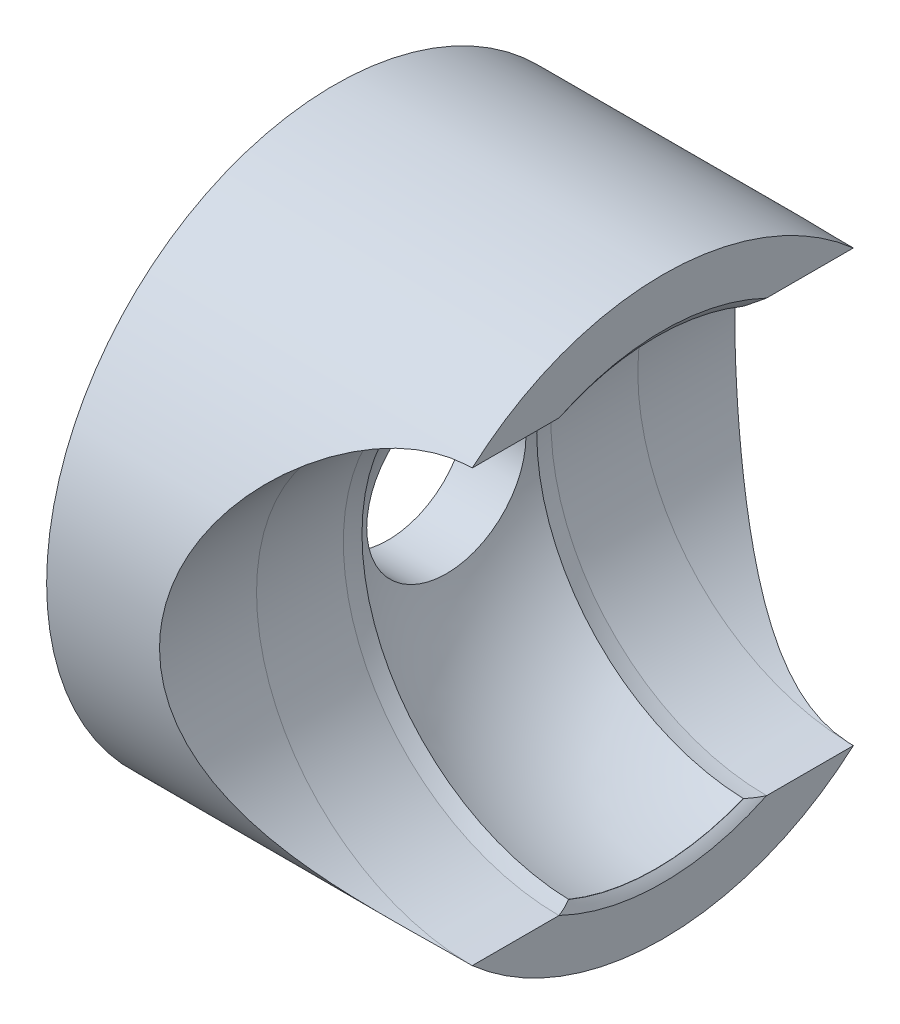
ISO-10303-21;
HEADER;
FILE_DESCRIPTION(('STEP AP214'),'2;1');
FILE_NAME('part.step','',(''),(''),'','','');
FILE_SCHEMA(('AUTOMOTIVE_DESIGN { 1 0 10303 214 1 1 1 1 }'));
ENDSEC;
DATA;
#1=APPLICATION_CONTEXT('core data for automotive mechanical design processes');
#2=APPLICATION_PROTOCOL_DEFINITION('international standard','automotive_design',2000,#1);
#3=PRODUCT_CONTEXT('',#1,'mechanical');
#4=PRODUCT('Part','Part','',(#3));
#5=PRODUCT_RELATED_PRODUCT_CATEGORY('part','',(#4));
#6=PRODUCT_DEFINITION_FORMATION('','',#4);
#7=PRODUCT_DEFINITION_CONTEXT('part definition',#1,'design');
#8=PRODUCT_DEFINITION('design','',#6,#7);
#9=PRODUCT_DEFINITION_SHAPE('','',#8);
#10=(LENGTH_UNIT() NAMED_UNIT(*) SI_UNIT(.MILLI.,.METRE.));
#11=(NAMED_UNIT(*) PLANE_ANGLE_UNIT() SI_UNIT($,.RADIAN.));
#12=(NAMED_UNIT(*) SI_UNIT($,.STERADIAN.) SOLID_ANGLE_UNIT());
#13=UNCERTAINTY_MEASURE_WITH_UNIT(LENGTH_MEASURE(1.E-05),#10,'distance_accuracy_value','');
#14=(GEOMETRIC_REPRESENTATION_CONTEXT(3) GLOBAL_UNCERTAINTY_ASSIGNED_CONTEXT((#13)) GLOBAL_UNIT_ASSIGNED_CONTEXT((#10,
#11,#12)) REPRESENTATION_CONTEXT('',''));
#15=CARTESIAN_POINT('',(0.,0.,0.));
#16=DIRECTION('',(0.,0.,1.));
#17=DIRECTION('',(1.,0.,0.));
#18=AXIS2_PLACEMENT_3D('',#15,#16,#17);
#19=CARTESIAN_POINT('',(0.,0.,0.));
#20=DIRECTION('',(-1.,0.,0.));
#21=DIRECTION('',(0.,0.,1.));
#22=AXIS2_PLACEMENT_3D('',#19,#20,#21);
#23=CYLINDRICAL_SURFACE('',#22,3.705);
#24=CARTESIAN_POINT('',(0.,0.,0.));
#25=DIRECTION('',(-1.,0.,0.));
#26=DIRECTION('',(0.,0.,1.));
#27=AXIS2_PLACEMENT_3D('',#24,#25,#26);
#28=CIRCLE('',#27,3.705);
#29=CARTESIAN_POINT('',(0.,0.,3.705));
#30=VERTEX_POINT('',#29);
#31=EDGE_CURVE('E412',#30,#30,#28,.T.);
#32=ORIENTED_EDGE('',*,*,#31,.T.);
#33=EDGE_LOOP('',(#32));
#34=FACE_BOUND('',#33,.T.);
#35=CARTESIAN_POINT('',(2.71106507152368,0.,0.));
#36=DIRECTION('',(1.,0.,0.));
#37=DIRECTION('',(0.,0.,-1.));
#38=AXIS2_PLACEMENT_3D('',#35,#36,#37);
#39=CIRCLE('',#38,3.705);
#40=CARTESIAN_POINT('',(2.71106507152368,0.,-3.705));
#41=VERTEX_POINT('',#40);
#42=EDGE_CURVE('E296',#41,#41,#39,.F.);
#43=ORIENTED_EDGE('',*,*,#42,.F.);
#44=EDGE_LOOP('',(#43));
#45=FACE_BOUND('',#44,.T.);
#46=ADVANCED_FACE('F32',(#34,#45),#23,.F.);
#47=CARTESIAN_POINT('',(15.8522364141583,0.,0.));
#48=DIRECTION('',(-1.,0.,0.));
#49=DIRECTION('',(0.,0.,1.));
#50=AXIS2_PLACEMENT_3D('',#47,#48,#49);
#51=DEGENERATE_TOROIDAL_SURFACE('',#50,0.00207785317474923,11.2452963928574,.F.);
#52=CARTESIAN_POINT('',(12.4573385449547,9.91767036352963,4.06529539084349));
#53=CARTESIAN_POINT('',(12.4600735336928,9.9180132482366,4.06673884580065));
#54=CARTESIAN_POINT('',(12.462808522431,9.91835613294358,4.0681823007578));
#55=CARTESIAN_POINT('',(12.4655435111691,9.91869901765055,4.06962575571496));
#56=B_SPLINE_CURVE_WITH_KNOTS('',3,(#52,#53,#54,#55),.UNSPECIFIED.,.F.,.F.,(4,4),(0.,
0.00933443409108968),.UNSPECIFIED.);
#57=CARTESIAN_POINT('',(12.4573385449547,9.91767036352963,4.06529539084349));
#58=VERTEX_POINT('',#57);
#59=CARTESIAN_POINT('',(12.4655435111691,9.91869901765054,4.06962575571494));
#60=VERTEX_POINT('',#59);
#61=EDGE_CURVE('E53',#58,#60,#56,.T.);
#62=ORIENTED_EDGE('',*,*,#61,.F.);
#63=CARTESIAN_POINT('',(12.4573385449547,0.,0.));
#64=DIRECTION('',(-1.,0.,0.));
#65=DIRECTION('',(0.,0.,1.));
#66=AXIS2_PLACEMENT_3D('',#63,#64,#65);
#67=CIRCLE('',#66,10.7185265803863);
#68=CARTESIAN_POINT('',(12.4573385449547,9.91767036352941,-4.06529539084404));
#69=VERTEX_POINT('',#68);
#70=EDGE_CURVE('E11',#69,#58,#67,.F.);
#71=ORIENTED_EDGE('',*,*,#70,.F.);
#72=CARTESIAN_POINT('',(12.4655435111691,9.91869901507637,-4.06962576198887));
#73=CARTESIAN_POINT('',(12.462808522431,9.91835613122738,-4.06818230494059));
#74=CARTESIAN_POINT('',(12.4600735336928,9.91801324737839,-4.06673884789231));
#75=CARTESIAN_POINT('',(12.4573385449547,9.91767036352941,-4.06529539084404));
#76=B_SPLINE_CURVE_WITH_KNOTS('',3,(#72,#73,#74,#75),.UNSPECIFIED.,.F.,.F.,(4,4),(0.,
0.00933443671773793),.UNSPECIFIED.);
#77=CARTESIAN_POINT('',(12.4655435111691,9.91869901507637,-4.06962576198885));
#78=VERTEX_POINT('',#77);
#79=EDGE_CURVE('E306',#78,#69,#76,.T.);
#80=ORIENTED_EDGE('',*,*,#79,.F.);
#81=CARTESIAN_POINT('',(12.4655435111691,0.,0.));
#82=DIRECTION('',(-1.,0.,0.));
#83=DIRECTION('',(0.,0.,1.));
#84=AXIS2_PLACEMENT_3D('',#81,#82,#83);
#85=CIRCLE('',#84,10.7211213963055);
#86=EDGE_CURVE('E124',#60,#78,#85,.T.);
#87=ORIENTED_EDGE('',*,*,#86,.F.);
#88=EDGE_LOOP('',(#62,#71,#80,#87));
#89=FACE_BOUND('',#88,.T.);
#90=ADVANCED_FACE('F298',(#89),#51,.T.);
#91=CARTESIAN_POINT('',(12.4655435111691,-9.91869901765002,4.06962575571625));
#92=CARTESIAN_POINT('',(12.4628085224302,-9.91835613294294,4.06818230075866));
#93=CARTESIAN_POINT('',(12.4600735336912,-9.91801324823586,4.06673884580108));
#94=CARTESIAN_POINT('',(12.4573385449522,-9.91767036352879,4.06529539084349));
#95=B_SPLINE_CURVE_WITH_KNOTS('',3,(#91,#92,#93,#94),.UNSPECIFIED.,.F.,.F.,(4,4),(0.,
0.00933443409387512),.UNSPECIFIED.);
#96=CARTESIAN_POINT('',(12.4655435111691,-9.91869901765001,4.06962575571623));
#97=VERTEX_POINT('',#96);
#98=CARTESIAN_POINT('',(12.4573385449547,-9.91767036352925,4.06529539084349));
#99=VERTEX_POINT('',#98);
#100=EDGE_CURVE('E283',#97,#99,#95,.T.);
#101=ORIENTED_EDGE('',*,*,#100,.F.);
#102=CARTESIAN_POINT('',(12.4655435111691,-9.91869901507584,-4.06962576199015));
#103=VERTEX_POINT('',#102);
#104=EDGE_CURVE('E352',#103,#97,#85,.T.);
#105=ORIENTED_EDGE('',*,*,#104,.F.);
#106=CARTESIAN_POINT('',(12.4573385449522,-9.91767036352856,-4.06529539084404));
#107=CARTESIAN_POINT('',(12.4600735336912,-9.91801324737766,-4.06673884789275));
#108=CARTESIAN_POINT('',(12.4628085224302,-9.91835613122675,-4.06818230494146));
#109=CARTESIAN_POINT('',(12.4655435111691,-9.91869901507584,-4.06962576199017));
#110=B_SPLINE_CURVE_WITH_KNOTS('',3,(#106,#107,#108,#109),.UNSPECIFIED.,.F.,.F.,(4,4),(0.,
0.00933443672053999),.UNSPECIFIED.);
#111=CARTESIAN_POINT('',(12.4573385449522,-9.91767036352856,-4.06529539084404));
#112=VERTEX_POINT('',#111);
#113=EDGE_CURVE('E312',#112,#103,#110,.T.);
#114=ORIENTED_EDGE('',*,*,#113,.F.);
#115=EDGE_CURVE('E35',#99,#112,#67,.F.);
#116=ORIENTED_EDGE('',*,*,#115,.F.);
#117=EDGE_LOOP('',(#101,#105,#114,#116));
#118=FACE_BOUND('',#117,.T.);
#119=ADVANCED_FACE('F301',(#118),#51,.T.);
#120=CARTESIAN_POINT('',(10.6602444579042,0.,0.));
#121=DIRECTION('',(-1.,0.,0.));
#122=DIRECTION('',(0.,0.,1.));
#123=AXIS2_PLACEMENT_3D('',#120,#121,#122);
#124=TOROIDAL_SURFACE('',#123,12.453081435281,2.50175743195208);
#125=CARTESIAN_POINT('',(12.4655435111691,9.91869901765054,4.06962575571494));
#126=CARTESIAN_POINT('',(12.4975500775213,9.93029585414373,4.12933305698702));
#127=CARTESIAN_POINT('',(12.5278194405048,9.94104822091573,4.19009104578075));
#128=CARTESIAN_POINT('',(12.5852624688243,9.96105096209351,4.31313724660543));
#129=CARTESIAN_POINT('',(12.612442679479,9.97030453055624,4.37542186998062));
#130=CARTESIAN_POINT('',(12.6644709507504,9.98762828518208,4.50182020608333));
#131=CARTESIAN_POINT('',(12.6892939130116,9.99568616042427,4.56594578300298));
#132=CARTESIAN_POINT('',(12.7366775118008,10.0107620896404,4.69531217300692));
#133=CARTESIAN_POINT('',(12.7592330823981,10.0177778312128,4.76055511822493));
#134=CARTESIAN_POINT('',(12.7807869250002,10.0243814340573,4.82615099049963));
#135=B_SPLINE_CURVE_WITH_KNOTS('',3,(#125,#126,#127,#128,#129,#130,#131,#132,#133,#134),
.UNSPECIFIED.,.F.,.F.,(4,2,2,2,4),(0.,0.206100545800962,0.411755925795426,0.61940034399599,
0.827498836478843),.UNSPECIFIED.);
#136=CARTESIAN_POINT('',(12.7807869250002,10.0243814340573,4.82615099049962));
#137=VERTEX_POINT('',#136);
#138=EDGE_CURVE('E288',#60,#137,#135,.T.);
#139=ORIENTED_EDGE('',*,*,#138,.F.);
#140=ORIENTED_EDGE('',*,*,#86,.T.);
#141=CARTESIAN_POINT('',(12.7807869250002,10.0243814322363,-4.82615099428205));
#142=CARTESIAN_POINT('',(12.7594229173717,10.0178354283886,-4.76113134161743));
#143=CARTESIAN_POINT('',(12.7370734785348,10.0108835742621,-4.69645979329115));
#144=CARTESIAN_POINT('',(12.6901444719873,9.99595586414979,-4.56821398722269));
#145=CARTESIAN_POINT('',(12.6655698192932,9.98798224957255,-4.50463766329205));
#146=CARTESIAN_POINT('',(12.6136338759561,9.97070332742244,-4.3781948712688));
#147=CARTESIAN_POINT('',(12.5862517897628,9.96138783876801,-4.31533820526894));
#148=CARTESIAN_POINT('',(12.5283547132782,9.94123692149215,-4.19117094333502));
#149=CARTESIAN_POINT('',(12.4978330291159,9.93039822648501,-4.12986401309356));
#150=CARTESIAN_POINT('',(12.4655435111691,9.91869901507636,-4.06962576198885));
#151=B_SPLINE_CURVE_WITH_KNOTS('',3,(#141,#142,#143,#144,#145,#146,#147,#148,#149,#150),
.UNSPECIFIED.,.F.,.F.,(4,2,2,2,4),(0.,0.206268670064945,0.412092361470221,0.619569113407174,
0.827497770213909),.UNSPECIFIED.);
#152=CARTESIAN_POINT('',(12.7807869250002,10.0243814322363,-4.82615099428204));
#153=VERTEX_POINT('',#152);
#154=EDGE_CURVE('E323',#153,#78,#151,.T.);
#155=ORIENTED_EDGE('',*,*,#154,.F.);
#156=CARTESIAN_POINT('',(12.7807869250002,0.,0.));
#157=DIRECTION('',(-1.,0.,0.));
#158=DIRECTION('',(0.,0.,1.));
#159=AXIS2_PLACEMENT_3D('',#156,#157,#158);
#160=CIRCLE('',#159,11.125644094549);
#161=EDGE_CURVE('E350',#137,#153,#160,.T.);
#162=ORIENTED_EDGE('',*,*,#161,.F.);
#163=EDGE_LOOP('',(#139,#140,#155,#162));
#164=FACE_BOUND('',#163,.T.);
#165=ADVANCED_FACE('F210',(#164),#124,.T.);
#166=CARTESIAN_POINT('',(12.7807869250002,-10.0243814340567,4.82615099050095));
#167=CARTESIAN_POINT('',(12.7594230314017,-10.0178358570372,4.76113132403372));
#168=CARTESIAN_POINT('',(12.737074399683,-10.0108854309364,4.69645930427595));
#169=CARTESIAN_POINT('',(12.6901470478596,-9.99596040516526,4.56821261787291));
#170=CARTESIAN_POINT('',(12.6655732457969,-9.98798804867943,4.50463588381042));
#171=CARTESIAN_POINT('',(12.6136375891545,-9.97070927944996,4.37819296422454));
#172=CARTESIAN_POINT('',(12.5862549213592,-9.96139266341403,4.31533659090637));
#173=CARTESIAN_POINT('',(12.5283563002286,-9.94123911144289,4.19117011055527));
#174=CARTESIAN_POINT('',(12.4978336480941,-9.9303989062867,4.12986367211717));
#175=CARTESIAN_POINT('',(12.4655435111691,-9.91869901765001,4.06962575571623));
#176=B_SPLINE_CURVE_WITH_KNOTS('',3,(#166,#167,#168,#169,#170,#171,#172,#173,#174,#175),
.UNSPECIFIED.,.F.,.F.,(4,2,2,2,4),(0.,0.206268691351201,0.412092127686695,0.619569159971689,
0.827498379997236),.UNSPECIFIED.);
#177=CARTESIAN_POINT('',(12.7807869250002,-10.0243814340567,4.82615099050093));
#178=VERTEX_POINT('',#177);
#179=EDGE_CURVE('E277',#178,#97,#176,.T.);
#180=ORIENTED_EDGE('',*,*,#179,.F.);
#181=CARTESIAN_POINT('',(12.7807869250002,-10.0243814322357,-4.82615099428335));
#182=VERTEX_POINT('',#181);
#183=EDGE_CURVE('E344',#182,#178,#160,.T.);
#184=ORIENTED_EDGE('',*,*,#183,.F.);
#185=CARTESIAN_POINT('',(12.4655435111691,-9.91869901507584,-4.06962576199015));
#186=CARTESIAN_POINT('',(12.4975495670727,-9.93029523000338,-4.12933355753578));
#187=CARTESIAN_POINT('',(12.5278180519829,-9.94104612994538,-4.1900922119641));
#188=CARTESIAN_POINT('',(12.585259680642,-9.96104628796296,-4.31313956111081));
#189=CARTESIAN_POINT('',(12.6124393649661,-9.97029873739287,-4.37542466997035));
#190=CARTESIAN_POINT('',(12.6644678572323,-9.9876225687987,-4.50182291636464));
#191=CARTESIAN_POINT('',(12.6892915881507,-9.99568166661489,-4.56594790583115));
#192=CARTESIAN_POINT('',(12.7366767025589,-10.0107602394095,-4.69531304525114));
#193=CARTESIAN_POINT('',(12.7592330233118,-10.0177774038855,-4.76055532603309));
#194=CARTESIAN_POINT('',(12.7807869250002,-10.0243814322357,-4.82615099428336));
#195=B_SPLINE_CURVE_WITH_KNOTS('',3,(#185,#186,#187,#188,#189,#190,#191,#192,#193,#194),
.UNSPECIFIED.,.F.,.F.,(4,2,2,2,4),(0.,0.206100578400036,0.41175626744033,0.619400352283926,
0.827498226479929),.UNSPECIFIED.);
#196=EDGE_CURVE('E316',#103,#182,#195,.T.);
#197=ORIENTED_EDGE('',*,*,#196,.F.);
#198=ORIENTED_EDGE('',*,*,#104,.T.);
#199=EDGE_LOOP('',(#180,#184,#197,#198));
#200=FACE_BOUND('',#199,.T.);
#201=ADVANCED_FACE('F208',(#200),#124,.T.);
#202=CARTESIAN_POINT('',(12.7807869250002,0.,0.));
#203=DIRECTION('',(1.,0.,0.));
#204=DIRECTION('',(0.,0.,-1.));
#205=AXIS2_PLACEMENT_3D('',#202,#203,#204);
#206=CONICAL_SURFACE('',#205,11.125644094549,1.57046118111369);
#207=CARTESIAN_POINT('',(12.7807876206625,10.0247800217848,4.83010697209728));
#208=CARTESIAN_POINT('',(12.7808879510821,10.0248106641141,5.5027651655204));
#209=CARTESIAN_POINT('',(12.7810011068223,10.0248452362198,6.17542335631656));
#210=CARTESIAN_POINT('',(12.7812530689441,10.0249222399836,7.52073973382749));
#211=CARTESIAN_POINT('',(12.7813918753258,10.0249646716419,8.19339792054226));
#212=CARTESIAN_POINT('',(12.7815435070281,10.0250110330764,8.86605610463006));
#213=B_SPLINE_CURVE_WITH_KNOTS('',3,(#207,#208,#209,#210,#211,#212),.UNSPECIFIED.,.F.,.F.,(4,2,
4),(0.,2.01797460360667,4.03594921073099),.UNSPECIFIED.);
#214=CARTESIAN_POINT('',(12.7807876206625,10.0247800217848,4.83010697209728));
#215=VERTEX_POINT('',#214);
#216=CARTESIAN_POINT('',(12.7815435070281,10.0250110330764,8.86605610463006));
#217=VERTEX_POINT('',#216);
#218=EDGE_CURVE('E224',#215,#217,#213,.T.);
#219=ORIENTED_EDGE('',*,*,#218,.F.);
#220=CARTESIAN_POINT('',(12.7807869250002,10.0243814340573,4.82615099049962));
#221=CARTESIAN_POINT('',(12.7807871568876,10.0245142966332,4.82746965103217));
#222=CARTESIAN_POINT('',(12.780787388775,10.024647159209,4.82878831156473));
#223=CARTESIAN_POINT('',(12.7807876206625,10.0247800217848,4.83010697209728));
#224=B_SPLINE_CURVE_WITH_KNOTS('',3,(#220,#221,#222,#223),.UNSPECIFIED.,.F.,.F.,(4,4),(0.,
0.00397601094835977),.UNSPECIFIED.);
#225=EDGE_CURVE('E247',#137,#215,#224,.T.);
#226=ORIENTED_EDGE('',*,*,#225,.F.);
#227=ORIENTED_EDGE('',*,*,#161,.T.);
#228=CARTESIAN_POINT('',(12.7807876206625,10.0247800217859,-4.83010697211818));
#229=CARTESIAN_POINT('',(12.780787388775,10.0246471586027,-4.82878831283947));
#230=CARTESIAN_POINT('',(12.7807871568876,10.0245142954195,-4.82746965356076));
#231=CARTESIAN_POINT('',(12.7807869250002,10.0243814322363,-4.82615099428205));
#232=B_SPLINE_CURVE_WITH_KNOTS('',3,(#228,#229,#230,#231),.UNSPECIFIED.,.F.,.F.,(4,4),(0.,
0.00397600738844435),.UNSPECIFIED.);
#233=CARTESIAN_POINT('',(12.7807876206625,10.0247800217859,-4.83010697211818));
#234=VERTEX_POINT('',#233);
#235=EDGE_CURVE('E237',#234,#153,#232,.T.);
#236=ORIENTED_EDGE('',*,*,#235,.F.);
#237=CARTESIAN_POINT('',(12.7815435070281,10.0250110330775,-8.86605610462885));
#238=CARTESIAN_POINT('',(12.781391875326,10.024964671643,-8.19339792161844));
#239=CARTESIAN_POINT('',(12.7812530689446,10.0249222399848,-7.52073973598106));
#240=CARTESIAN_POINT('',(12.7810011068227,10.0248452362209,-6.1754233584775));
#241=CARTESIAN_POINT('',(12.7808879510823,10.0248106641153,-5.50276516661132));
#242=CARTESIAN_POINT('',(12.7807876206625,10.0247800217859,-4.83010697211818));
#243=B_SPLINE_CURVE_WITH_KNOTS('',3,(#237,#238,#239,#240,#241,#242),.UNSPECIFIED.,.F.,.F.,(4,2,
4),(0.,2.01797460389214,4.03594921070888),.UNSPECIFIED.);
#244=CARTESIAN_POINT('',(12.7815435070281,10.0250110330775,-8.86605610462885));
#245=VERTEX_POINT('',#244);
#246=EDGE_CURVE('E193',#245,#234,#243,.T.);
#247=ORIENTED_EDGE('',*,*,#246,.F.);
#248=CARTESIAN_POINT('',(12.7815435070281,0.,0.));
#249=DIRECTION('',(-1.,0.,0.));
#250=DIRECTION('',(0.,0.,1.));
#251=AXIS2_PLACEMENT_3D('',#248,#249,#250);
#252=CIRCLE('',#251,13.3831161193405);
#253=EDGE_CURVE('E136',#217,#245,#252,.T.);
#254=ORIENTED_EDGE('',*,*,#253,.F.);
#255=EDGE_LOOP('',(#219,#226,#227,#236,#247,#254));
#256=FACE_BOUND('',#255,.T.);
#257=ADVANCED_FACE('F203',(#256),#206,.F.);
#258=CARTESIAN_POINT('',(12.7815435070281,-10.0250110330757,8.86605610463092));
#259=CARTESIAN_POINT('',(12.781391875326,-10.0249646716412,8.19339792161669));
#260=CARTESIAN_POINT('',(12.7812530689446,-10.024922239983,7.52073973597548));
#261=CARTESIAN_POINT('',(12.7810011068227,-10.0248452362191,6.17542335846427));
#262=CARTESIAN_POINT('',(12.7808879510822,-10.0248106641134,5.50276516659426));
#263=CARTESIAN_POINT('',(12.7807876206625,-10.0247800217841,4.83010697209728));
#264=B_SPLINE_CURVE_WITH_KNOTS('',3,(#258,#259,#260,#261,#262,#263),.UNSPECIFIED.,.F.,.F.,(4,2,
4),(0.,2.01797460390362,4.03594921073185),.UNSPECIFIED.);
#265=CARTESIAN_POINT('',(12.7815435070281,-10.0250110330757,8.86605610463092));
#266=VERTEX_POINT('',#265);
#267=CARTESIAN_POINT('',(12.7807876206624,-10.0247800217841,4.83010697209728));
#268=VERTEX_POINT('',#267);
#269=EDGE_CURVE('E217',#266,#268,#264,.T.);
#270=ORIENTED_EDGE('',*,*,#269,.F.);
#271=CARTESIAN_POINT('',(12.7815435070281,-10.0250110330767,-8.86605610462971));
#272=VERTEX_POINT('',#271);
#273=EDGE_CURVE('E340',#272,#266,#252,.T.);
#274=ORIENTED_EDGE('',*,*,#273,.F.);
#275=CARTESIAN_POINT('',(12.7807876206625,-10.0247800217852,-4.83010697211818));
#276=CARTESIAN_POINT('',(12.7808879510821,-10.0248106641145,-5.50276516553776));
#277=CARTESIAN_POINT('',(12.7810011068223,-10.0248452362201,-6.17542335633038));
#278=CARTESIAN_POINT('',(12.7812530689441,-10.0249222399839,-7.52073973383422));
#279=CARTESIAN_POINT('',(12.7813918753258,-10.0249646716422,-8.19339792054545));
#280=CARTESIAN_POINT('',(12.7815435070281,-10.0250110330767,-8.86605610462971));
#281=B_SPLINE_CURVE_WITH_KNOTS('',3,(#275,#276,#277,#278,#279,#280),.UNSPECIFIED.,.F.,.F.,(4,2,
4),(0.,2.01797460359605,4.03594921070974),.UNSPECIFIED.);
#282=CARTESIAN_POINT('',(12.7807876206625,-10.0247800217852,-4.83010697211818));
#283=VERTEX_POINT('',#282);
#284=EDGE_CURVE('E198',#283,#272,#281,.T.);
#285=ORIENTED_EDGE('',*,*,#284,.F.);
#286=CARTESIAN_POINT('',(12.7807869250002,-10.0243814322357,-4.82615099428335));
#287=CARTESIAN_POINT('',(12.7807871568876,-10.0245142954188,-4.82746965356163));
#288=CARTESIAN_POINT('',(12.780787388775,-10.024647158602,-4.8287883128399));
#289=CARTESIAN_POINT('',(12.7807876206624,-10.0247800217852,-4.83010697211818));
#290=B_SPLINE_CURVE_WITH_KNOTS('',3,(#286,#287,#288,#289),.UNSPECIFIED.,.F.,.F.,(4,4),(0.,
0.00397600738713336),.UNSPECIFIED.);
#291=EDGE_CURVE('E231',#182,#283,#290,.T.);
#292=ORIENTED_EDGE('',*,*,#291,.F.);
#293=ORIENTED_EDGE('',*,*,#183,.T.);
#294=CARTESIAN_POINT('',(12.7807876206624,-10.0247800217841,4.83010697209728));
#295=CARTESIAN_POINT('',(12.780787388775,-10.0246471592083,4.82878831156516));
#296=CARTESIAN_POINT('',(12.7807871568876,-10.0245142966325,4.82746965103305));
#297=CARTESIAN_POINT('',(12.7807869250002,-10.0243814340567,4.82615099050093));
#298=B_SPLINE_CURVE_WITH_KNOTS('',3,(#294,#295,#296,#297),.UNSPECIFIED.,.F.,.F.,(4,4),(0.,
0.00397601094703739),.UNSPECIFIED.);
#299=EDGE_CURVE('E242',#268,#178,#298,.T.);
#300=ORIENTED_EDGE('',*,*,#299,.F.);
#301=EDGE_LOOP('',(#270,#274,#285,#292,#293,#300));
#302=FACE_BOUND('',#301,.T.);
#303=ADVANCED_FACE('F207',(#302),#206,.F.);
#304=CARTESIAN_POINT('',(0.,0.,0.));
#305=DIRECTION('',(-1.,0.,0.));
#306=DIRECTION('',(0.,0.,1.));
#307=AXIS2_PLACEMENT_3D('',#304,#305,#306);
#308=CYLINDRICAL_SURFACE('',#307,13.3831161193405);
#309=CARTESIAN_POINT('',(-2.50303312003632,0.,0.));
#310=DIRECTION('',(-1.,0.,0.));
#311=DIRECTION('',(0.,0.,1.));
#312=AXIS2_PLACEMENT_3D('',#309,#310,#311);
#313=CIRCLE('',#312,13.3831161193405);
#314=CARTESIAN_POINT('',(-2.50303312003632,0.,13.3831161193405));
#315=VERTEX_POINT('',#314);
#316=EDGE_CURVE('E342',#315,#315,#313,.T.);
#317=ORIENTED_EDGE('',*,*,#316,.F.);
#318=EDGE_LOOP('',(#317));
#319=FACE_BOUND('',#318,.T.);
#320=CARTESIAN_POINT('',(12.7815435070281,10.0250110330764,8.86605610463006));
#321=CARTESIAN_POINT('',(12.7409445628482,10.0250420146504,8.86602120183748));
#322=CARTESIAN_POINT('',(12.7003520058293,10.0248265618299,8.86626480037065));
#323=CARTESIAN_POINT('',(12.6191796661133,10.0239027874001,8.86730900008848));
#324=CARTESIAN_POINT('',(12.5785998834162,10.0231944657907,8.86810960127315));
#325=CARTESIAN_POINT('',(12.5380264878801,10.0222397097869,8.86918870378356));
#326=B_SPLINE_CURVE_WITH_KNOTS('',3,(#320,#321,#322,#323,#324,#325),.UNSPECIFIED.,.F.,.F.,(4,2,
4),(0.,0.121781579105768,0.243563158211533),.UNSPECIFIED.);
#327=CARTESIAN_POINT('',(12.5380264878801,10.0222397097869,8.86918870378356));
#328=VERTEX_POINT('',#327);
#329=EDGE_CURVE('E367',#217,#328,#326,.T.);
#330=ORIENTED_EDGE('',*,*,#329,.F.);
#331=ORIENTED_EDGE('',*,*,#253,.T.);
#332=CARTESIAN_POINT('',(12.5380264877983,10.0222397097861,-8.86918870378452));
#333=CARTESIAN_POINT('',(12.578599883348,10.0231944657905,-8.86810960127337));
#334=CARTESIAN_POINT('',(12.6191796660587,10.0239027874004,-8.86730900008816));
#335=CARTESIAN_POINT('',(12.700352005802,10.0248265618309,-8.8662648003696));
#336=CARTESIAN_POINT('',(12.7409445628346,10.0250420146515,-8.86602120183626));
#337=CARTESIAN_POINT('',(12.7815435070281,10.0250110330775,-8.86605610462885));
#338=B_SPLINE_CURVE_WITH_KNOTS('',3,(#332,#333,#334,#335,#336,#337),.UNSPECIFIED.,.F.,.F.,(4,2,
4),(0.,0.121781579146704,0.243563158293405),.UNSPECIFIED.);
#339=CARTESIAN_POINT('',(12.5380264877983,10.0222397097861,-8.86918870378452));
#340=VERTEX_POINT('',#339);
#341=EDGE_CURVE('E123',#340,#245,#338,.T.);
#342=ORIENTED_EDGE('',*,*,#341,.F.);
#343=CARTESIAN_POINT('',(12.5380264878307,-10.0222397097861,-8.86918870378452));
#344=CARTESIAN_POINT('',(12.4170767686185,-10.0193965203535,-8.87239565989872));
#345=CARTESIAN_POINT('',(12.2962711567214,-10.0143594630777,-8.87809088919812));
#346=CARTESIAN_POINT('',(12.055269873966,-9.99995444892052,-8.89431544489202));
#347=CARTESIAN_POINT('',(11.9350740750409,-9.99058744295425,-8.90484370988321));
#348=CARTESIAN_POINT('',(11.5764429869204,-9.95613475642897,-8.94339959278807));
#349=CARTESIAN_POINT('',(11.3393158031473,-9.92468158840478,-8.97841697488392));
#350=CARTESIAN_POINT('',(10.8740126572606,-9.84614006326746,-9.06447085149932));
#351=CARTESIAN_POINT('',(10.6457604484031,-9.79926001590936,-9.1152934505343));
#352=CARTESIAN_POINT('',(10.1962151570395,-9.69072409881895,-9.23059730058575));
#353=CARTESIAN_POINT('',(9.97492688503532,-9.62905825835571,-9.29508776504216));
#354=CARTESIAN_POINT('',(9.49221818491058,-9.47676881181551,-9.45055225522246));
#355=CARTESIAN_POINT('',(9.2327417902968,-9.38275720509296,-9.54422918301872));
#356=CARTESIAN_POINT('',(8.72632096245903,-9.17568331955462,-9.74347346981338));
#357=CARTESIAN_POINT('',(8.47937865099771,-9.06261782921006,-9.84904283228344));
#358=CARTESIAN_POINT('',(7.99694563742435,-8.81790720774344,-10.0687385067123));
#359=CARTESIAN_POINT('',(7.76152472497299,-8.6861641224514,-10.1829083411937));
#360=CARTESIAN_POINT('',(7.30371369362716,-8.4053816103276,-10.4158841652547));
#361=CARTESIAN_POINT('',(7.08132273909508,-8.25634329450522,-10.5346898567116));
#362=CARTESIAN_POINT('',(6.64538728183321,-7.93831852898507,-10.7764371143998));
#363=CARTESIAN_POINT('',(6.43211161353195,-7.76899041606998,-10.8994137703464));
#364=CARTESIAN_POINT('',(6.01970492446454,-7.41325572336904,-11.1444196172871));
#365=CARTESIAN_POINT('',(5.82057447878868,-7.22684844991496,-11.2664487695798));
#366=CARTESIAN_POINT('',(5.43757708843913,-6.83769873814166,-11.5067745614299));
#367=CARTESIAN_POINT('',(5.25367728076646,-6.63499343414771,-11.6250788767521));
#368=CARTESIAN_POINT('',(4.90156226027308,-6.21314918852054,-11.8559010730696));
#369=CARTESIAN_POINT('',(4.73335164780342,-5.99400546062125,-11.9684172525705));
#370=CARTESIAN_POINT('',(4.43046400360935,-5.5633168862102,-12.1740797885703));
#371=CARTESIAN_POINT('',(4.2941179957223,-5.35332816166246,-12.2680261292332));
#372=CARTESIAN_POINT('',(4.03625055546814,-4.92120265744967,-12.4476612925114));
#373=CARTESIAN_POINT('',(3.91472138577323,-4.69907230665718,-12.5333544199871));
#374=CARTESIAN_POINT('',(3.6875950959136,-4.24327902903924,-12.6949142650313));
#375=CARTESIAN_POINT('',(3.58200176784157,-4.00961337477323,-12.7707786431448));
#376=CARTESIAN_POINT('',(3.38807001371927,-3.53188014495528,-12.9110644322083));
#377=CARTESIAN_POINT('',(3.29973157704008,-3.28781257581097,-12.9754858502071));
#378=CARTESIAN_POINT('',(3.14095111604561,-2.78872041312057,-13.0918680449034));
#379=CARTESIAN_POINT('',(3.07065939806515,-2.53362324433077,-13.1437239784764));
#380=CARTESIAN_POINT('',(2.95010679539792,-2.01623250414331,-13.2329702973999));
#381=CARTESIAN_POINT('',(2.89984609263473,-1.75393886740977,-13.2703605513716));
#382=CARTESIAN_POINT('',(2.82034028879751,-1.2246538978946,-13.3296239118554));
#383=CARTESIAN_POINT('',(2.79107872481354,-0.957666413614939,-13.3515091738025));
#384=CARTESIAN_POINT('',(2.75410869411373,-0.421387555420158,-13.379173541271));
#385=CARTESIAN_POINT('',(2.74639724990135,-0.152096504937542,-13.3849548718099));
#386=CARTESIAN_POINT('',(2.75225188126721,0.349953415126031,-13.3805701523117));
#387=CARTESIAN_POINT('',(2.76310321062333,0.582768446653288,-13.3724387595768));
#388=CARTESIAN_POINT('',(2.80089520093758,1.046332987769,-13.3441706206292));
#389=CARTESIAN_POINT('',(2.82783415289747,1.27708271411376,-13.3240351496177));
#390=CARTESIAN_POINT('',(2.89739512377187,1.73488771655126,-13.27219056751));
#391=CARTESIAN_POINT('',(2.94001806746133,1.96194277397079,-13.2404807739581));
#392=CARTESIAN_POINT('',(3.04034011326212,2.41086669383332,-13.1661419865202));
#393=CARTESIAN_POINT('',(3.09803977498647,2.63273536343645,-13.1235125873248));
#394=CARTESIAN_POINT('',(3.22730553340467,3.06844297321655,-13.0284998874751));
#395=CARTESIAN_POINT('',(3.29876948747223,3.2823279992995,-12.9761885403023));
#396=CARTESIAN_POINT('',(3.45501766566479,3.70274323850586,-12.8625414613722));
#397=CARTESIAN_POINT('',(3.53980654573453,3.90927084977088,-12.8012025757246));
#398=CARTESIAN_POINT('',(3.81283697045121,4.51636442475944,-12.6051891869325));
#399=CARTESIAN_POINT('',(4.01983932601226,4.90476265720906,-12.4584455472392));
#400=CARTESIAN_POINT('',(4.51040523559441,5.69772458683259,-12.1184106821075));
#401=CARTESIAN_POINT('',(4.80070896778303,6.09651809377581,-11.9214575362901));
#402=CARTESIAN_POINT('',(5.27316142944017,6.65583023409008,-11.61263730885));
#403=CARTESIAN_POINT('',(5.43700720978393,6.83596003136408,-11.5073454470655));
#404=CARTESIAN_POINT('',(5.77642586220268,7.18300820040234,-11.293964120492));
#405=CARTESIAN_POINT('',(5.95199625609186,7.34992934783246,-11.1858752498356));
#406=CARTESIAN_POINT('',(6.35045187718828,7.70225937909511,-10.9470027248594));
#407=CARTESIAN_POINT('',(6.57579756921794,7.88473192958837,-10.8159854188367));
#408=CARTESIAN_POINT('',(7.04215586276274,8.22998142004518,-10.5556593921551));
#409=CARTESIAN_POINT('',(7.28317290062586,8.39275274521256,-10.4263511678894));
#410=CARTESIAN_POINT('',(7.78045930179052,8.69780776785438,-10.1732587705357));
#411=CARTESIAN_POINT('',(8.03672251941127,8.84009964249233,-10.0494724063448));
#412=CARTESIAN_POINT('',(8.56437204817452,9.10318016917796,-9.81179386502507));
#413=CARTESIAN_POINT('',(8.83575039802357,9.2239800032658,-9.69789655862994));
#414=CARTESIAN_POINT('',(9.30556318793527,9.40818199942571,-9.51865878842132));
#415=CARTESIAN_POINT('',(9.50009176968786,9.47768650949303,-9.44931389921008));
#416=CARTESIAN_POINT('',(9.89583472809344,9.60526160823334,-9.31960400763208));
#417=CARTESIAN_POINT('',(10.0970491607142,9.66333210116309,-9.25923908046044));
#418=CARTESIAN_POINT('',(10.5048146735377,9.76710824483471,-9.14970375144009));
#419=CARTESIAN_POINT('',(10.7113434767205,9.81285845978378,-9.10049310810716));
#420=CARTESIAN_POINT('',(11.1293860840178,9.89150044532232,-9.01495412420947));
#421=CARTESIAN_POINT('',(11.3408968955327,9.92439973639565,-8.97861825036636));
#422=CARTESIAN_POINT('',(11.7164808037119,9.97043423066502,-8.92743779070681));
#423=CARTESIAN_POINT('',(11.8797937882882,9.98641501138275,-8.90953110268818));
#424=CARTESIAN_POINT('',(12.2079900651321,10.0103893630002,-8.88257396464123));
#425=CARTESIAN_POINT('',(12.3728754426057,10.01837018398,-8.8735376522296));
#426=CARTESIAN_POINT('',(12.5380264877983,10.0222397097861,-8.86918870378452));
#427=B_SPLINE_CURVE_WITH_KNOTS('',3,(#343,#344,#345,#346,#347,#348,#349,#350,#351,#352,#353,
#354,#355,#356,#357,#358,#359,#360,#361,#362,#363,#364,#365,#366,#367,#368,#369,#370,#371,#372,
#373,#374,#375,#376,#377,#378,#379,#380,#381,#382,#383,#384,#385,#386,#387,#388,#389,#390,#391,
#392,#393,#394,#395,#396,#397,#398,#399,#400,#401,#402,#403,#404,#405,#406,#407,#408,#409,#410,
#411,#412,#413,#414,#415,#416,#417,#418,#419,#420,#421,#422,#423,#424,#425,#426),.UNSPECIFIED.,
.F.,.F.,(4,2,2,2,2,2,2,2,2,2,2,2,2,2,2,2,2,2,2,2,2,2,2,2,2,2,2,2,2,2,2,2,2,2,2,2,2,2,2,2,2,4),
(0.,0.362982104842516,0.725884531766394,1.44975347297007,2.16422370199807,2.87917709248695,
3.75220085064791,4.62537190425484,5.50330443083336,6.38118059205125,7.27675989038362,
8.17237557870819,9.06600552754616,9.95989668621326,10.7613865673794,11.5624561027637,
12.3637159610944,13.164975325852,13.9727062135179,14.7804444369049,15.5875487156271,
16.3945414743641,17.0933121243694,17.7920085567314,18.4907461929226,19.1895097683295,
19.8832749076177,20.5772830008702,21.9642789350438,23.5516416063076,24.3470294281708,
25.1422496608941,26.0958040785807,27.0496296199856,28.0030732490388,28.9560193532949,
29.609218899857,30.2624239157804,30.913233453921,31.563661559432,32.0584434465979,
32.5540126436118),.UNSPECIFIED.);
#428=CARTESIAN_POINT('',(12.5380264878307,-10.0222397097861,-8.86918870378452));
#429=VERTEX_POINT('',#428);
#430=EDGE_CURVE('E118',#429,#340,#427,.T.);
#431=ORIENTED_EDGE('',*,*,#430,.F.);
#432=CARTESIAN_POINT('',(12.7815435070281,-10.0250110330767,-8.86605610462971));
#433=CARTESIAN_POINT('',(12.74094456284,-10.0250420146507,-8.86602120183712));
#434=CARTESIAN_POINT('',(12.7003520058128,-10.0248265618302,-8.8662648003704));
#435=CARTESIAN_POINT('',(12.6191796660803,-10.0239027873999,-8.86730900008867));
#436=CARTESIAN_POINT('',(12.5785998833751,-10.0231944657903,-8.86810960127366));
#437=CARTESIAN_POINT('',(12.5380264878307,-10.0222397097861,-8.86918870378452));
#438=B_SPLINE_CURVE_WITH_KNOTS('',3,(#432,#433,#434,#435,#436,#437),.UNSPECIFIED.,.F.,.F.,(4,2,
4),(0.,0.121781579130473,0.243563158260945),.UNSPECIFIED.);
#439=EDGE_CURVE('E129',#272,#429,#438,.T.);
#440=ORIENTED_EDGE('',*,*,#439,.F.);
#441=ORIENTED_EDGE('',*,*,#273,.T.);
#442=CARTESIAN_POINT('',(12.5380264879125,-10.0222397097869,8.86918870378356));
#443=CARTESIAN_POINT('',(12.5785998834433,-10.0231944657905,8.86810960127344));
#444=CARTESIAN_POINT('',(12.6191796661349,-10.0239027873997,8.86730900008899));
#445=CARTESIAN_POINT('',(12.7003520058401,-10.0248265618292,8.86626480037145));
#446=CARTESIAN_POINT('',(12.7409445628536,-10.0250420146496,8.86602120183836));
#447=CARTESIAN_POINT('',(12.7815435070281,-10.0250110330757,8.86605610463093));
#448=B_SPLINE_CURVE_WITH_KNOTS('',3,(#442,#443,#444,#445,#446,#447),.UNSPECIFIED.,.F.,.F.,(4,2,
4),(0.,0.121781579089533,0.243563158179066),.UNSPECIFIED.);
#449=CARTESIAN_POINT('',(12.5380264879125,-10.0222397097869,8.86918870378356));
#450=VERTEX_POINT('',#449);
#451=EDGE_CURVE('E138',#450,#266,#448,.T.);
#452=ORIENTED_EDGE('',*,*,#451,.F.);
#453=CARTESIAN_POINT('',(12.5380264878801,10.0222397097869,8.86918870378356));
#454=CARTESIAN_POINT('',(12.4170767686685,10.019396520355,8.87239565989707));
#455=CARTESIAN_POINT('',(12.296271156772,10.0143594630798,8.87809088919576));
#456=CARTESIAN_POINT('',(12.0552698740176,9.9999544489239,8.89431544488821));
#457=CARTESIAN_POINT('',(11.935074075093,9.9905874429583,8.90484370987867));
#458=CARTESIAN_POINT('',(11.5764429869739,9.95613475643506,8.94339959278128));
#459=CARTESIAN_POINT('',(11.3393158032016,9.92468158841229,8.97841697487561));
#460=CARTESIAN_POINT('',(10.8740126573163,9.84614006327786,9.064470851488));
#461=CARTESIAN_POINT('',(10.6457604484595,9.79926001592125,9.1152934505215));
#462=CARTESIAN_POINT('',(10.196215157097,9.69072409883388,9.23059730057006));
#463=CARTESIAN_POINT('',(9.97492688509333,9.6290582583722,9.29508776502506));
#464=CARTESIAN_POINT('',(9.49221818497007,9.47676881183569,9.45055225520218));
#465=CARTESIAN_POINT('',(9.23274179035725,9.38275720511534,9.54422918299668));
#466=CARTESIAN_POINT('',(8.72632096252117,9.17568331958156,9.74347346978796));
#467=CARTESIAN_POINT('',(8.47937865106059,9.06261782923938,9.84904283225641));
#468=CARTESIAN_POINT('',(7.99694563748852,8.81790720777769,10.0687385066823));
#469=CARTESIAN_POINT('',(7.76152472503771,8.68616412248822,10.1829083411622));
#470=CARTESIAN_POINT('',(7.30371369369278,8.40538161036973,10.4158841652207));
#471=CARTESIAN_POINT('',(7.08132273916105,8.2563432945501,10.5346898566764));
#472=CARTESIAN_POINT('',(6.64538728189964,7.9383185290357,10.7764371143624));
#473=CARTESIAN_POINT('',(6.43211161359849,7.7689904161236,10.8994137703081));
#474=CARTESIAN_POINT('',(6.01970492453104,7.41325572342886,11.1444196172472));
#475=CARTESIAN_POINT('',(5.82057447885503,7.22684844997799,11.2664487695393));
#476=CARTESIAN_POINT('',(5.43757708850487,6.83769873821129,11.5067745613884));
#477=CARTESIAN_POINT('',(5.25367728083173,6.63499343422074,11.6250788767104));
#478=CARTESIAN_POINT('',(4.90156226033706,6.21314918860054,11.8559010730276));
#479=CARTESIAN_POINT('',(4.73335164786658,5.99400546070483,11.9684172525285));
#480=CARTESIAN_POINT('',(4.4304640036686,5.56331688629793,12.1740797885302));
#481=CARTESIAN_POINT('',(4.29411799577868,5.35332816175057,12.2680261291948));
#482=CARTESIAN_POINT('',(4.03625055551883,4.9212026575383,12.4476612924763));
#483=CARTESIAN_POINT('',(3.91472138582108,4.69907230674595,12.5333544199538));
#484=CARTESIAN_POINT('',(3.68759509595584,4.243279029128,12.6949142650017));
#485=CARTESIAN_POINT('',(3.58200176788103,4.00961337486185,12.770778643117));
#486=CARTESIAN_POINT('',(3.38807001375322,3.53188014504333,12.9110644321842));
#487=CARTESIAN_POINT('',(3.29973157707132,3.28781257589858,12.975485850185));
#488=CARTESIAN_POINT('',(3.14095111607147,2.78872041320695,13.091868044885));
#489=CARTESIAN_POINT('',(3.07065939808836,2.53362324441635,13.1437239784599));
#490=CARTESIAN_POINT('',(2.95010679541599,2.01623250422696,13.2329702973872));
#491=CARTESIAN_POINT('',(2.8998460926503,1.75393886749229,13.2703605513608));
#492=CARTESIAN_POINT('',(2.82034028880829,1.22465389797456,13.3296239118481));
#493=CARTESIAN_POINT('',(2.79107872482203,0.957666413693474,13.3515091737969));
#494=CARTESIAN_POINT('',(2.75410869411789,0.42138755549555,13.3791735412687));
#495=CARTESIAN_POINT('',(2.74639724990348,0.15209650501122,13.3849548718091));
#496=CARTESIAN_POINT('',(2.75225188126581,-0.349953415054826,13.3805701523135));
#497=CARTESIAN_POINT('',(2.76310321062033,-0.582768446582814,13.3724387595798));
#498=CARTESIAN_POINT('',(2.8008952009315,-1.04633298770015,13.3441706206346));
#499=CARTESIAN_POINT('',(2.82783415288991,-1.27708271404579,13.3240351496242));
#500=CARTESIAN_POINT('',(2.89739512376148,-1.73488771648521,13.2721905675186));
#501=CARTESIAN_POINT('',(2.94001806744958,-1.96194277390576,13.2404807739677));
#502=CARTESIAN_POINT('',(3.04034011324782,-2.41086669377044,13.1661419865317));
#503=CARTESIAN_POINT('',(3.09803977497097,-2.63273536337469,13.1235125873372));
#504=CARTESIAN_POINT('',(3.22730553338662,-3.06844297315611,13.0284998874894));
#505=CARTESIAN_POINT('',(3.29876948745278,-3.28232799923928,12.9761885403175));
#506=CARTESIAN_POINT('',(3.45501766564255,-3.7027432384462,12.8625414613894));
#507=CARTESIAN_POINT('',(3.53980654571091,-3.90927084971156,12.8012025757427));
#508=CARTESIAN_POINT('',(3.8128369704235,-4.51636442470128,12.6051891869534));
#509=CARTESIAN_POINT('',(4.0198393259819,-4.90476265715186,12.4584455472618));
#510=CARTESIAN_POINT('',(4.51040523555789,-5.69772458677683,12.1184106821337));
#511=CARTESIAN_POINT('',(4.8007089677429,-6.09651809372066,11.9214575363183));
#512=CARTESIAN_POINT('',(5.27316142939454,-6.65583023403624,11.6126373088808));
#513=CARTESIAN_POINT('',(5.43700720973645,-6.83596003131075,11.5073454470972));
#514=CARTESIAN_POINT('',(5.77642586215144,-7.18300820035013,11.2939641205252));
#515=CARTESIAN_POINT('',(5.95199625603873,-7.34992934778088,11.1858752498694));
#516=CARTESIAN_POINT('',(6.35045187713099,-7.70225937904513,10.9470027248945));
#517=CARTESIAN_POINT('',(6.57579756915837,-7.88473192953937,10.8159854188724));
#518=CARTESIAN_POINT('',(7.04215586269854,-8.22998141999835,10.5556593921916));
#519=CARTESIAN_POINT('',(7.2831729005593,-8.39275274516693,10.4263511679262));
#520=CARTESIAN_POINT('',(7.78045930171915,-8.69780776781137,10.1732587705725));
#521=CARTESIAN_POINT('',(8.03672251933745,-8.84009964245075,10.0494724063814));
#522=CARTESIAN_POINT('',(8.56437204809572,-9.10318016913952,9.81179386506076));
#523=CARTESIAN_POINT('',(8.83575039794222,-9.22398000322908,9.69789655866489));
#524=CARTESIAN_POINT('',(9.30556318785048,-9.40818199939254,9.51865878845413));
#525=CARTESIAN_POINT('',(9.50009176960221,-9.47768650946155,9.44931389924169));
#526=CARTESIAN_POINT('',(9.89583472800615,-9.60526160820529,9.31960400766101));
#527=CARTESIAN_POINT('',(10.0970491606261,-9.6633321011368,9.25923908048789));
#528=CARTESIAN_POINT('',(10.5048146734481,-9.76710824481204,9.14970375146431));
#529=CARTESIAN_POINT('',(10.7113434766303,-9.81285845976295,9.10049310812964));
#530=CARTESIAN_POINT('',(11.1293860839264,-9.89150044530528,9.01495412422818));
#531=CARTESIAN_POINT('',(11.3408968954408,-9.92439973638054,8.97861825038307));
#532=CARTESIAN_POINT('',(11.7164808036534,-9.97043423065752,8.92743779071521));
#533=CARTESIAN_POINT('',(11.8797937882638,-9.98641501137928,8.90953110269207));
#534=CARTESIAN_POINT('',(12.2079900651766,-10.0103893630015,8.88257396463982));
#535=CARTESIAN_POINT('',(12.3728754426851,-10.0183701839819,8.8735376522274));
#536=CARTESIAN_POINT('',(12.5380264879125,-10.0222397097869,8.86918870378356));
#537=B_SPLINE_CURVE_WITH_KNOTS('',3,(#453,#454,#455,#456,#457,#458,#459,#460,#461,#462,#463,
#464,#465,#466,#467,#468,#469,#470,#471,#472,#473,#474,#475,#476,#477,#478,#479,#480,#481,#482,
#483,#484,#485,#486,#487,#488,#489,#490,#491,#492,#493,#494,#495,#496,#497,#498,#499,#500,#501,
#502,#503,#504,#505,#506,#507,#508,#509,#510,#511,#512,#513,#514,#515,#516,#517,#518,#519,#520,
#521,#522,#523,#524,#525,#526,#527,#528,#529,#530,#531,#532,#533,#534,#535,#536),.UNSPECIFIED.,
.F.,.F.,(4,2,2,2,2,2,2,2,2,2,2,2,2,2,2,2,2,2,2,2,2,2,2,2,2,2,2,2,2,2,2,2,2,2,2,2,2,2,2,2,2,4),
(0.,0.362982104840683,0.725884531762728,1.44975347296278,2.16422370198712,2.87917709247231,
3.75220085062689,4.62537190422744,5.50330443079953,6.38118059201101,7.27675989033691,
8.17237557865502,9.06600552748659,9.9598966861473,10.7613865673186,11.5624561027082,
12.3637159610441,13.164975325807,13.9727062134783,14.7804444368707,15.5875487155983,
16.3945414743407,17.0933121243478,17.7920085567117,18.4907461929047,19.1895097683134,
19.8832749076002,20.5772830008513,21.9642789350222,23.5516416062793,24.3470294281391,
25.1422496608589,26.0958040785418,27.0496296199429,28.0030732489924,28.9560193532447,
29.6092188998073,30.2624239157311,30.9132334538722,31.5636615593838,32.0584434466533,
32.5540126437714),.UNSPECIFIED.);
#538=EDGE_CURVE('E368',#328,#450,#537,.T.);
#539=ORIENTED_EDGE('',*,*,#538,.F.);
#540=EDGE_LOOP('',(#330,#331,#342,#431,#440,#441,#452,#539));
#541=FACE_BOUND('',#540,.T.);
#542=ADVANCED_FACE('F134',(#319,#541),#308,.T.);
#543=CARTESIAN_POINT('',(-3.74721783915236,0.,0.));
#544=DIRECTION('',(-1.,0.,0.));
#545=DIRECTION('',(0.,0.,1.));
#546=AXIS2_PLACEMENT_3D('',#543,#544,#545);
#547=TOROIDAL_SURFACE('',#546,13.3150962550643,1.24604266267974);
#548=CARTESIAN_POINT('',(-2.50613327366593,0.,0.));
#549=DIRECTION('',(-1.,0.,0.));
#550=DIRECTION('',(0.,0.,1.));
#551=AXIS2_PLACEMENT_3D('',#548,#549,#550);
#552=CIRCLE('',#551,13.2040493346686);
#553=CARTESIAN_POINT('',(-2.50613327366593,0.,13.2040493346686));
#554=VERTEX_POINT('',#553);
#555=EDGE_CURVE('E346',#554,#554,#552,.T.);
#556=ORIENTED_EDGE('',*,*,#555,.F.);
#557=EDGE_LOOP('',(#556));
#558=FACE_BOUND('',#557,.T.);
#559=ORIENTED_EDGE('',*,*,#316,.T.);
#560=EDGE_LOOP('',(#559));
#561=FACE_BOUND('',#560,.T.);
#562=ADVANCED_FACE('F395',(#558,#561),#547,.F.);
#563=CARTESIAN_POINT('',(-2.50613327366593,0.,-13.2040493346686));
#564=DIRECTION('',(1.,0.,0.));
#565=DIRECTION('',(0.,0.,-1.));
#566=AXIS2_PLACEMENT_3D('',#563,#564,#565);
#567=PLANE('',#566);
#568=CARTESIAN_POINT('',(-2.50613327366593,0.,0.));
#569=DIRECTION('',(-1.,0.,0.));
#570=DIRECTION('',(0.,0.,1.));
#571=AXIS2_PLACEMENT_3D('',#568,#569,#570);
#572=CIRCLE('',#571,9.63773693985803);
#573=CARTESIAN_POINT('',(-2.50613327366593,0.,9.63773693985803));
#574=VERTEX_POINT('',#573);
#575=EDGE_CURVE('E418',#574,#574,#572,.T.);
#576=ORIENTED_EDGE('',*,*,#575,.F.);
#577=EDGE_LOOP('',(#576));
#578=FACE_BOUND('',#577,.T.);
#579=ORIENTED_EDGE('',*,*,#555,.T.);
#580=EDGE_LOOP('',(#579));
#581=FACE_BOUND('',#580,.T.);
#582=ADVANCED_FACE('F392',(#578,#581),#567,.F.);
#583=CARTESIAN_POINT('',(0.,0.,0.));
#584=DIRECTION('',(-1.,0.,0.));
#585=DIRECTION('',(0.,0.,1.));
#586=AXIS2_PLACEMENT_3D('',#583,#584,#585);
#587=CYLINDRICAL_SURFACE('',#586,9.63773693985803);
#588=CARTESIAN_POINT('',(0.,0.,0.));
#589=DIRECTION('',(-1.,0.,0.));
#590=DIRECTION('',(0.,0.,1.));
#591=AXIS2_PLACEMENT_3D('',#588,#589,#590);
#592=CIRCLE('',#591,9.63773693985803);
#593=CARTESIAN_POINT('',(0.,0.,9.63773693985803));
#594=VERTEX_POINT('',#593);
#595=EDGE_CURVE('E416',#594,#594,#592,.T.);
#596=ORIENTED_EDGE('',*,*,#595,.F.);
#597=EDGE_LOOP('',(#596));
#598=FACE_BOUND('',#597,.T.);
#599=ORIENTED_EDGE('',*,*,#575,.T.);
#600=EDGE_LOOP('',(#599));
#601=FACE_BOUND('',#600,.T.);
#602=ADVANCED_FACE('F388',(#598,#601),#587,.F.);
#603=CARTESIAN_POINT('',(0.,0.,-9.63773693985803));
#604=DIRECTION('',(1.,0.,0.));
#605=DIRECTION('',(0.,0.,-1.));
#606=AXIS2_PLACEMENT_3D('',#603,#604,#605);
#607=PLANE('',#606);
#608=ORIENTED_EDGE('',*,*,#31,.F.);
#609=EDGE_LOOP('',(#608));
#610=FACE_BOUND('',#609,.T.);
#611=ORIENTED_EDGE('',*,*,#595,.T.);
#612=EDGE_LOOP('',(#611));
#613=FACE_BOUND('',#612,.T.);
#614=ADVANCED_FACE('F385',(#610,#613),#607,.F.);
#615=CARTESIAN_POINT('',(12.7738667263341,0.,0.));
#616=DIRECTION('',(0.,0.,-1.));
#617=DIRECTION('',(0.,1.,0.));
#618=AXIS2_PLACEMENT_3D('',#615,#616,#617);
#619=SPHERICAL_SURFACE('',#618,10.7231992494803);
#620=ORIENTED_EDGE('',*,*,#115,.T.);
#621=CARTESIAN_POINT('',(12.7738667263341,3.82080514874791E-13,-4.06529539084404));
#622=DIRECTION('',(0.,0.,-1.));
#623=DIRECTION('',(0.,1.,0.));
#624=AXIS2_PLACEMENT_3D('',#621,#622,#623);
#625=CIRCLE('',#624,9.92272016783852);
#626=EDGE_CURVE('E182',#112,#69,#625,.T.);
#627=ORIENTED_EDGE('',*,*,#626,.T.);
#628=ORIENTED_EDGE('',*,*,#70,.T.);
#629=CARTESIAN_POINT('',(12.7738667263341,3.82090292298311E-13,4.06529539084349));
#630=DIRECTION('',(0.,0.,-1.));
#631=DIRECTION('',(0.,1.,0.));
#632=AXIS2_PLACEMENT_3D('',#629,#630,#631);
#633=CIRCLE('',#632,9.92272016783874);
#634=EDGE_CURVE('E185',#99,#58,#633,.T.);
#635=ORIENTED_EDGE('',*,*,#634,.F.);
#636=EDGE_LOOP('',(#620,#627,#628,#635));
#637=FACE_BOUND('',#636,.T.);
#638=ORIENTED_EDGE('',*,*,#42,.T.);
#639=EDGE_LOOP('',(#638));
#640=FACE_BOUND('',#639,.T.);
#641=ADVANCED_FACE('F254',(#637,#640),#619,.F.);
#642=CARTESIAN_POINT('',(12.7738667263341,10.0247824108035,4.83010697209728));
#643=CARTESIAN_POINT('',(12.7738667263341,9.9983286395795,4.56724944228546));
#644=CARTESIAN_POINT('',(12.7738667263341,9.96639387433806,4.3105134133903));
#645=CARTESIAN_POINT('',(12.7738667263341,9.92272016783913,4.06529539084349));
#646=B_SPLINE_CURVE_WITH_KNOTS('',3,(#642,#643,#644,#645),.UNSPECIFIED.,.F.,.F.,(4,4),(0.,1.),.UNSPECIFIED.);
#647=CARTESIAN_POINT('',(12.7738667263341,3.82066069320314E-13,-16.0777536654389));
#648=DIRECTION('',(0.,0.,-1.));
#649=AXIS1_PLACEMENT('',#647,#648);
#650=SURFACE_OF_REVOLUTION('',#646,#649);
#651=ORIENTED_EDGE('',*,*,#61,.T.);
#652=ORIENTED_EDGE('',*,*,#138,.T.);
#653=ORIENTED_EDGE('',*,*,#225,.T.);
#654=CARTESIAN_POINT('',(12.7738667263341,3.82091212020745E-13,4.83010697209728));
#655=DIRECTION('',(0.,0.,-1.));
#656=DIRECTION('',(0.,1.,0.));
#657=AXIS2_PLACEMENT_3D('',#654,#655,#656);
#658=CIRCLE('',#657,10.0247824108031);
#659=EDGE_CURVE('E187',#268,#215,#658,.T.);
#660=ORIENTED_EDGE('',*,*,#659,.F.);
#661=ORIENTED_EDGE('',*,*,#299,.T.);
#662=ORIENTED_EDGE('',*,*,#179,.T.);
#663=ORIENTED_EDGE('',*,*,#100,.T.);
#664=ORIENTED_EDGE('',*,*,#634,.T.);
#665=EDGE_LOOP('',(#651,#652,#653,#660,#661,#662,#663,#664));
#666=FACE_BOUND('',#665,.T.);
#667=ADVANCED_FACE('F251',(#666),#650,.F.);
#668=CARTESIAN_POINT('',(12.7738667263341,9.9227201678389,-4.06529539084404));
#669=CARTESIAN_POINT('',(12.7738667263341,9.96625024133101,-4.30970694641849));
#670=CARTESIAN_POINT('',(12.7738667263341,9.99825738095631,-4.56654138197251));
#671=CARTESIAN_POINT('',(12.7738667263341,10.0247824108046,-4.83010697211818));
#672=B_SPLINE_CURVE_WITH_KNOTS('',3,(#668,#669,#670,#671),.UNSPECIFIED.,.F.,.F.,(4,4),(0.,1.),.UNSPECIFIED.);
#673=CARTESIAN_POINT('',(12.7738667263341,3.82066069320314E-13,-16.0777536654389));
#674=DIRECTION('',(0.,0.,-1.));
#675=AXIS1_PLACEMENT('',#673,#674);
#676=SURFACE_OF_REVOLUTION('',#672,#675);
#677=ORIENTED_EDGE('',*,*,#113,.T.);
#678=ORIENTED_EDGE('',*,*,#196,.T.);
#679=ORIENTED_EDGE('',*,*,#291,.T.);
#680=CARTESIAN_POINT('',(12.7738667263341,3.82079595152357E-13,-4.83010697211818));
#681=DIRECTION('',(0.,0.,-1.));
#682=DIRECTION('',(0.,1.,0.));
#683=AXIS2_PLACEMENT_3D('',#680,#681,#682);
#684=CIRCLE('',#683,10.0247824108042);
#685=EDGE_CURVE('E130',#283,#234,#684,.T.);
#686=ORIENTED_EDGE('',*,*,#685,.T.);
#687=ORIENTED_EDGE('',*,*,#235,.T.);
#688=ORIENTED_EDGE('',*,*,#154,.T.);
#689=ORIENTED_EDGE('',*,*,#79,.T.);
#690=ORIENTED_EDGE('',*,*,#626,.F.);
#691=EDGE_LOOP('',(#677,#678,#679,#686,#687,#688,#689,#690));
#692=FACE_BOUND('',#691,.T.);
#693=ADVANCED_FACE('F163',(#692),#676,.F.);
#694=CARTESIAN_POINT('',(12.7738667263341,3.82066069320314E-13,-16.0777536654389));
#695=DIRECTION('',(0.,0.,-1.));
#696=DIRECTION('',(0.,1.,0.));
#697=AXIS2_PLACEMENT_3D('',#694,#695,#696);
#698=CYLINDRICAL_SURFACE('',#697,10.0250141854511);
#699=ORIENTED_EDGE('',*,*,#538,.T.);
#700=CARTESIAN_POINT('',(12.7738667263341,3.82096069209328E-13,8.86918870378356));
#701=DIRECTION('',(0.,0.,-1.));
#702=DIRECTION('',(0.,1.,0.));
#703=AXIS2_PLACEMENT_3D('',#700,#701,#702);
#704=CIRCLE('',#703,10.0250141854511);
#705=EDGE_CURVE('E190',#450,#328,#704,.T.);
#706=ORIENTED_EDGE('',*,*,#705,.T.);
#707=EDGE_LOOP('',(#699,#706));
#708=FACE_BOUND('',#707,.T.);
#709=ADVANCED_FACE('F380',(#708),#698,.F.);
#710=CARTESIAN_POINT('',(12.7738667263341,10.0250141854515,8.86918870378356));
#711=CARTESIAN_POINT('',(12.7738667263341,10.0249225973546,7.52282813703695));
#712=CARTESIAN_POINT('',(12.7738667263341,10.0248424250167,6.17646755957617));
#713=CARTESIAN_POINT('',(12.7738667263341,10.0247824108035,4.83010697209728));
#714=B_SPLINE_CURVE_WITH_KNOTS('',3,(#710,#711,#712,#713),.UNSPECIFIED.,.F.,.F.,(4,4),
(-0.011257279631697,-0.00721819773958851),.UNSPECIFIED.);
#715=CARTESIAN_POINT('',(12.7738667263341,3.82066069320314E-13,-16.0777536654389));
#716=DIRECTION('',(0.,0.,-1.));
#717=AXIS1_PLACEMENT('',#715,#716);
#718=SURFACE_OF_REVOLUTION('',#714,#717);
#719=ORIENTED_EDGE('',*,*,#218,.T.);
#720=ORIENTED_EDGE('',*,*,#329,.T.);
#721=ORIENTED_EDGE('',*,*,#705,.F.);
#722=ORIENTED_EDGE('',*,*,#451,.T.);
#723=ORIENTED_EDGE('',*,*,#269,.T.);
#724=ORIENTED_EDGE('',*,*,#659,.T.);
#725=EDGE_LOOP('',(#719,#720,#721,#722,#723,#724));
#726=FACE_BOUND('',#725,.T.);
#727=ADVANCED_FACE('F161',(#726),#718,.F.);
#728=CARTESIAN_POINT('',(12.7738667263341,10.0247824108046,-4.83010697211818));
#729=CARTESIAN_POINT('',(12.7738667263341,10.0248424250178,-6.17646755959042));
#730=CARTESIAN_POINT('',(12.7738667263341,10.0249225973557,-7.52282813704455));
#731=CARTESIAN_POINT('',(12.7738667263341,10.0250141854526,-8.86918870378452));
#732=B_SPLINE_CURVE_WITH_KNOTS('',3,(#728,#729,#730,#731),.UNSPECIFIED.,.F.,.F.,(4,4),
(0.00244201633693256,0.00648109814546981),.UNSPECIFIED.);
#733=CARTESIAN_POINT('',(12.7738667263341,3.82066069320314E-13,-16.0777536654389));
#734=DIRECTION('',(0.,0.,-1.));
#735=AXIS1_PLACEMENT('',#733,#734);
#736=SURFACE_OF_REVOLUTION('',#732,#735);
#737=ORIENTED_EDGE('',*,*,#284,.T.);
#738=ORIENTED_EDGE('',*,*,#439,.T.);
#739=CARTESIAN_POINT('',(12.7738667263341,3.82074737963773E-13,-8.86918870378452));
#740=DIRECTION('',(0.,0.,-1.));
#741=DIRECTION('',(0.,1.,0.));
#742=AXIS2_PLACEMENT_3D('',#739,#740,#741);
#743=CIRCLE('',#742,10.0250141854522);
#744=EDGE_CURVE('E45',#429,#340,#743,.T.);
#745=ORIENTED_EDGE('',*,*,#744,.T.);
#746=ORIENTED_EDGE('',*,*,#341,.T.);
#747=ORIENTED_EDGE('',*,*,#246,.T.);
#748=ORIENTED_EDGE('',*,*,#685,.F.);
#749=EDGE_LOOP('',(#737,#738,#745,#746,#747,#748));
#750=FACE_BOUND('',#749,.T.);
#751=ADVANCED_FACE('F127',(#750),#736,.F.);
#752=CARTESIAN_POINT('',(12.7738667263341,3.82066069320314E-13,-16.0777536654389));
#753=DIRECTION('',(0.,0.,-1.));
#754=DIRECTION('',(0.,1.,0.));
#755=AXIS2_PLACEMENT_3D('',#752,#753,#754);
#756=CYLINDRICAL_SURFACE('',#755,10.0250141854522);
#757=ORIENTED_EDGE('',*,*,#430,.T.);
#758=ORIENTED_EDGE('',*,*,#744,.F.);
#759=EDGE_LOOP('',(#757,#758));
#760=FACE_BOUND('',#759,.T.);
#761=ADVANCED_FACE('F119',(#760),#756,.F.);
#762=CLOSED_SHELL('',(#46,#90,#119,#165,#201,#257,#303,#542,#562,#582,#602,#614,#641,#667,#693,
#709,#727,#751,#761));
#763=MANIFOLD_SOLID_BREP('B2',#762);
#764=ADVANCED_BREP_SHAPE_REPRESENTATION('',(#18,#763),#14);
#765=SHAPE_DEFINITION_REPRESENTATION(#9,#764);
ENDSEC;
END-ISO-10303-21;
